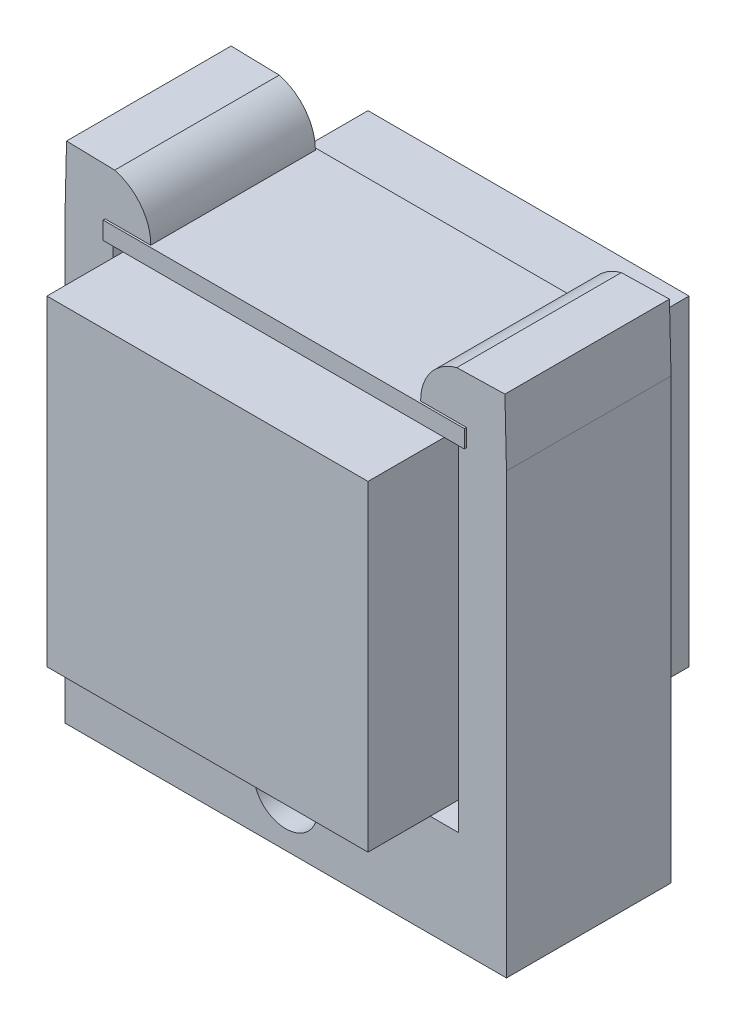
ISO-10303-21;
HEADER;
FILE_DESCRIPTION(('STEP AP214'),'2;1');
FILE_NAME('part.step','',(''),(''),'','','');
FILE_SCHEMA(('AUTOMOTIVE_DESIGN { 1 0 10303 214 1 1 1 1 }'));
ENDSEC;
DATA;
#1=APPLICATION_CONTEXT('core data for automotive mechanical design processes');
#2=APPLICATION_PROTOCOL_DEFINITION('international standard','automotive_design',2000,#1);
#3=PRODUCT_CONTEXT('',#1,'mechanical');
#4=PRODUCT('Part','Part','',(#3));
#5=PRODUCT_RELATED_PRODUCT_CATEGORY('part','',(#4));
#6=PRODUCT_DEFINITION_FORMATION('','',#4);
#7=PRODUCT_DEFINITION_CONTEXT('part definition',#1,'design');
#8=PRODUCT_DEFINITION('design','',#6,#7);
#9=PRODUCT_DEFINITION_SHAPE('','',#8);
#10=(LENGTH_UNIT() NAMED_UNIT(*) SI_UNIT(.MILLI.,.METRE.));
#11=(NAMED_UNIT(*) PLANE_ANGLE_UNIT() SI_UNIT($,.RADIAN.));
#12=(NAMED_UNIT(*) SI_UNIT($,.STERADIAN.) SOLID_ANGLE_UNIT());
#13=UNCERTAINTY_MEASURE_WITH_UNIT(LENGTH_MEASURE(1.E-05),#10,'distance_accuracy_value','');
#14=(GEOMETRIC_REPRESENTATION_CONTEXT(3) GLOBAL_UNCERTAINTY_ASSIGNED_CONTEXT((#13)) GLOBAL_UNIT_ASSIGNED_CONTEXT((#10,
#11,#12)) REPRESENTATION_CONTEXT('',''));
#15=CARTESIAN_POINT('',(0.,0.,0.));
#16=DIRECTION('',(0.,0.,1.));
#17=DIRECTION('',(1.,0.,0.));
#18=AXIS2_PLACEMENT_3D('',#15,#16,#17);
#19=CARTESIAN_POINT('',(-22.8214269050394,2.23208603977332,10.25));
#20=DIRECTION('',(0.,0.,-1.));
#21=DIRECTION('',(-1.,0.,0.));
#22=AXIS2_PLACEMENT_3D('',#19,#20,#21);
#23=CYLINDRICAL_SURFACE('',#22,6.01661439149229);
#24=CARTESIAN_POINT('',(-22.8214269050394,2.23208603977332,-10.25));
#25=DIRECTION('',(0.,0.,1.));
#26=DIRECTION('',(1.,0.,0.));
#27=AXIS2_PLACEMENT_3D('',#24,#25,#26);
#28=CIRCLE('',#27,6.01661439149229);
#29=CARTESIAN_POINT('',(-21.3065171783756,8.05486005702417,-10.25));
#30=VERTEX_POINT('',#29);
#31=CARTESIAN_POINT('',(-16.8065171783756,2.08887390342417,-10.25));
#32=VERTEX_POINT('',#31);
#33=EDGE_CURVE('E199',#30,#32,#28,.F.);
#34=ORIENTED_EDGE('',*,*,#33,.F.);
#35=DIRECTION('',(0.,0.,-1.));
#36=VECTOR('',#35,1.);
#37=CARTESIAN_POINT('',(-21.3065171783756,8.05486005702417,10.25));
#38=LINE('',#37,#36);
#39=CARTESIAN_POINT('',(-21.3065171783756,8.05486005702417,10.25));
#40=VERTEX_POINT('',#39);
#41=EDGE_CURVE('E12',#40,#30,#38,.T.);
#42=ORIENTED_EDGE('',*,*,#41,.F.);
#43=CARTESIAN_POINT('',(-22.8214269050394,2.23208603977332,10.25));
#44=DIRECTION('',(0.,0.,1.));
#45=DIRECTION('',(1.,0.,0.));
#46=AXIS2_PLACEMENT_3D('',#43,#44,#45);
#47=CIRCLE('',#46,6.01661439149229);
#48=CARTESIAN_POINT('',(-16.8065171783756,2.08887390342417,10.25));
#49=VERTEX_POINT('',#48);
#50=EDGE_CURVE('E242',#40,#49,#47,.F.);
#51=ORIENTED_EDGE('',*,*,#50,.T.);
#52=DIRECTION('',(0.,0.,-1.));
#53=VECTOR('',#52,1.);
#54=CARTESIAN_POINT('',(-16.8065171783756,2.08887390342417,10.25));
#55=LINE('',#54,#53);
#56=EDGE_CURVE('E70',#49,#32,#55,.T.);
#57=ORIENTED_EDGE('',*,*,#56,.T.);
#58=EDGE_LOOP('',(#34,#42,#51,#57));
#59=FACE_BOUND('',#58,.T.);
#60=ADVANCED_FACE('F54',(#59),#23,.T.);
#61=CARTESIAN_POINT('',(0.179602042615673,7.54328578985767,10.25));
#62=DIRECTION('',(0.0238027779462909,0.999716673744136,0.));
#63=DIRECTION('',(-0.999716673744136,0.0238027779462909,0.));
#64=AXIS2_PLACEMENT_3D('',#61,#62,#63);
#65=PLANE('',#64);
#66=DIRECTION('',(0.999716673744136,-0.0238027779462909,0.));
#67=VECTOR('',#66,1.);
#68=CARTESIAN_POINT('',(0.179602042615673,7.54328578985767,-10.25));
#69=LINE('',#68,#67);
#70=CARTESIAN_POINT('',(-27.3048172208404,8.19767672470191,-10.25));
#71=VERTEX_POINT('',#70);
#72=EDGE_CURVE('E201',#71,#30,#69,.T.);
#73=ORIENTED_EDGE('',*,*,#72,.F.);
#74=DIRECTION('',(0.,0.,-1.));
#75=VECTOR('',#74,1.);
#76=CARTESIAN_POINT('',(-27.3048172208404,8.19767672470191,10.25));
#77=LINE('',#76,#75);
#78=CARTESIAN_POINT('',(-27.3048172208404,8.19767672470191,10.25));
#79=VERTEX_POINT('',#78);
#80=EDGE_CURVE('E62',#79,#71,#77,.T.);
#81=ORIENTED_EDGE('',*,*,#80,.F.);
#82=DIRECTION('',(0.999716673744136,-0.0238027779462909,0.));
#83=VECTOR('',#82,1.);
#84=CARTESIAN_POINT('',(0.179602042615673,7.54328578985767,10.25));
#85=LINE('',#84,#83);
#86=EDGE_CURVE('E293',#79,#40,#85,.T.);
#87=ORIENTED_EDGE('',*,*,#86,.T.);
#88=ORIENTED_EDGE('',*,*,#41,.T.);
#89=EDGE_LOOP('',(#73,#81,#87,#88));
#90=FACE_BOUND('',#89,.T.);
#91=ADVANCED_FACE('F279',(#90),#65,.T.);
#92=CARTESIAN_POINT('',(-27.4844192634561,0.654390934844237,10.25));
#93=DIRECTION('',(-0.999716673744136,0.0238027779462906,0.));
#94=DIRECTION('',(-0.0238027779462906,-0.999716673744136,0.));
#95=AXIS2_PLACEMENT_3D('',#92,#93,#94);
#96=PLANE('',#95);
#97=DIRECTION('',(0.0238027779462906,0.999716673744136,0.));
#98=VECTOR('',#97,1.);
#99=CARTESIAN_POINT('',(-27.4844192634561,0.654390934844237,-10.25));
#100=LINE('',#99,#98);
#101=CARTESIAN_POINT('',(-27.5,0.,-10.25));
#102=VERTEX_POINT('',#101);
#103=EDGE_CURVE('E204',#102,#71,#100,.T.);
#104=ORIENTED_EDGE('',*,*,#103,.F.);
#105=DIRECTION('',(0.,0.,-1.));
#106=VECTOR('',#105,1.);
#107=CARTESIAN_POINT('',(-27.5,0.,10.25));
#108=LINE('',#107,#106);
#109=CARTESIAN_POINT('',(-27.5,0.,10.25));
#110=VERTEX_POINT('',#109);
#111=EDGE_CURVE('E268',#110,#102,#108,.T.);
#112=ORIENTED_EDGE('',*,*,#111,.F.);
#113=DIRECTION('',(0.0238027779462906,0.999716673744136,0.));
#114=VECTOR('',#113,1.);
#115=CARTESIAN_POINT('',(-27.4844192634561,0.654390934844237,10.25));
#116=LINE('',#115,#114);
#117=EDGE_CURVE('E275',#110,#79,#116,.T.);
#118=ORIENTED_EDGE('',*,*,#117,.T.);
#119=ORIENTED_EDGE('',*,*,#80,.T.);
#120=EDGE_LOOP('',(#104,#112,#118,#119));
#121=FACE_BOUND('',#120,.T.);
#122=ADVANCED_FACE('F273',(#121),#96,.T.);
#123=CARTESIAN_POINT('',(-27.5,0.,10.25));
#124=DIRECTION('',(-1.,0.,0.));
#125=DIRECTION('',(0.,0.,1.));
#126=AXIS2_PLACEMENT_3D('',#123,#124,#125);
#127=PLANE('',#126);
#128=DIRECTION('',(0.,1.,0.));
#129=VECTOR('',#128,1.);
#130=CARTESIAN_POINT('',(-27.5,0.,-10.25));
#131=LINE('',#130,#129);
#132=CARTESIAN_POINT('',(-27.5,-54.7,-10.25));
#133=VERTEX_POINT('',#132);
#134=EDGE_CURVE('E207',#133,#102,#131,.T.);
#135=ORIENTED_EDGE('',*,*,#134,.F.);
#136=DIRECTION('',(0.,0.,-1.));
#137=VECTOR('',#136,1.);
#138=CARTESIAN_POINT('',(-27.5,-54.7,10.25));
#139=LINE('',#138,#137);
#140=CARTESIAN_POINT('',(-27.5,-54.7,10.25));
#141=VERTEX_POINT('',#140);
#142=EDGE_CURVE('E266',#141,#133,#139,.T.);
#143=ORIENTED_EDGE('',*,*,#142,.F.);
#144=DIRECTION('',(0.,1.,0.));
#145=VECTOR('',#144,1.);
#146=CARTESIAN_POINT('',(-27.5,0.,10.25));
#147=LINE('',#146,#145);
#148=EDGE_CURVE('E290',#141,#110,#147,.T.);
#149=ORIENTED_EDGE('',*,*,#148,.T.);
#150=ORIENTED_EDGE('',*,*,#111,.T.);
#151=EDGE_LOOP('',(#135,#143,#149,#150));
#152=FACE_BOUND('',#151,.T.);
#153=ADVANCED_FACE('F287',(#152),#127,.T.);
#154=CARTESIAN_POINT('',(0.,-54.7,10.25));
#155=DIRECTION('',(0.,-1.,0.));
#156=DIRECTION('',(0.,0.,-1.));
#157=AXIS2_PLACEMENT_3D('',#154,#155,#156);
#158=PLANE('',#157);
#159=DIRECTION('',(-1.,0.,0.));
#160=VECTOR('',#159,1.);
#161=CARTESIAN_POINT('',(0.,-54.7,-10.25));
#162=LINE('',#161,#160);
#163=CARTESIAN_POINT('',(27.5,-54.7,-10.25));
#164=VERTEX_POINT('',#163);
#165=EDGE_CURVE('E210',#164,#133,#162,.T.);
#166=ORIENTED_EDGE('',*,*,#165,.F.);
#167=DIRECTION('',(0.,0.,-1.));
#168=VECTOR('',#167,1.);
#169=CARTESIAN_POINT('',(27.5,-54.7,10.25));
#170=LINE('',#169,#168);
#171=CARTESIAN_POINT('',(27.5,-54.7,10.25));
#172=VERTEX_POINT('',#171);
#173=EDGE_CURVE('E264',#172,#164,#170,.T.);
#174=ORIENTED_EDGE('',*,*,#173,.F.);
#175=DIRECTION('',(-1.,0.,0.));
#176=VECTOR('',#175,1.);
#177=CARTESIAN_POINT('',(0.,-54.7,10.25));
#178=LINE('',#177,#176);
#179=EDGE_CURVE('E295',#172,#141,#178,.T.);
#180=ORIENTED_EDGE('',*,*,#179,.T.);
#181=ORIENTED_EDGE('',*,*,#142,.T.);
#182=EDGE_LOOP('',(#166,#174,#180,#181));
#183=FACE_BOUND('',#182,.T.);
#184=ADVANCED_FACE('F342',(#183),#158,.T.);
#185=CARTESIAN_POINT('',(27.5,0.,10.25));
#186=DIRECTION('',(-1.,0.,0.));
#187=DIRECTION('',(0.,0.,1.));
#188=AXIS2_PLACEMENT_3D('',#185,#186,#187);
#189=PLANE('',#188);
#190=DIRECTION('',(0.,1.,0.));
#191=VECTOR('',#190,1.);
#192=CARTESIAN_POINT('',(27.5,0.,-10.25));
#193=LINE('',#192,#191);
#194=CARTESIAN_POINT('',(27.5,0.,-10.25));
#195=VERTEX_POINT('',#194);
#196=EDGE_CURVE('E213',#164,#195,#193,.T.);
#197=ORIENTED_EDGE('',*,*,#196,.T.);
#198=DIRECTION('',(0.,0.,-1.));
#199=VECTOR('',#198,1.);
#200=CARTESIAN_POINT('',(27.5,0.,10.25));
#201=LINE('',#200,#199);
#202=CARTESIAN_POINT('',(27.5,0.,10.25));
#203=VERTEX_POINT('',#202);
#204=EDGE_CURVE('E261',#203,#195,#201,.T.);
#205=ORIENTED_EDGE('',*,*,#204,.F.);
#206=DIRECTION('',(0.,1.,0.));
#207=VECTOR('',#206,1.);
#208=CARTESIAN_POINT('',(27.5,0.,10.25));
#209=LINE('',#208,#207);
#210=EDGE_CURVE('E301',#172,#203,#209,.T.);
#211=ORIENTED_EDGE('',*,*,#210,.F.);
#212=ORIENTED_EDGE('',*,*,#173,.T.);
#213=EDGE_LOOP('',(#197,#205,#211,#212));
#214=FACE_BOUND('',#213,.T.);
#215=ADVANCED_FACE('F345',(#214),#189,.F.);
#216=CARTESIAN_POINT('',(27.4844192634561,0.654390934844237,10.25));
#217=DIRECTION('',(-0.999716673744136,-0.0238027779462906,0.));
#218=DIRECTION('',(0.0238027779462906,-0.999716673744136,0.));
#219=AXIS2_PLACEMENT_3D('',#216,#217,#218);
#220=PLANE('',#219);
#221=DIRECTION('',(-0.0238027779462906,0.999716673744136,0.));
#222=VECTOR('',#221,1.);
#223=CARTESIAN_POINT('',(27.4844192634561,0.654390934844237,-10.25));
#224=LINE('',#223,#222);
#225=CARTESIAN_POINT('',(27.3048172208404,8.19767672470191,-10.25));
#226=VERTEX_POINT('',#225);
#227=EDGE_CURVE('E215',#195,#226,#224,.T.);
#228=ORIENTED_EDGE('',*,*,#227,.T.);
#229=DIRECTION('',(0.,0.,-1.));
#230=VECTOR('',#229,1.);
#231=CARTESIAN_POINT('',(27.3048172208404,8.19767672470191,10.25));
#232=LINE('',#231,#230);
#233=CARTESIAN_POINT('',(27.3048172208404,8.19767672470191,10.25));
#234=VERTEX_POINT('',#233);
#235=EDGE_CURVE('E258',#234,#226,#232,.T.);
#236=ORIENTED_EDGE('',*,*,#235,.F.);
#237=DIRECTION('',(-0.0238027779462906,0.999716673744136,0.));
#238=VECTOR('',#237,1.);
#239=CARTESIAN_POINT('',(27.4844192634561,0.654390934844237,10.25));
#240=LINE('',#239,#238);
#241=EDGE_CURVE('E303',#203,#234,#240,.T.);
#242=ORIENTED_EDGE('',*,*,#241,.F.);
#243=ORIENTED_EDGE('',*,*,#204,.T.);
#244=EDGE_LOOP('',(#228,#236,#242,#243));
#245=FACE_BOUND('',#244,.T.);
#246=ADVANCED_FACE('F349',(#245),#220,.F.);
#247=CARTESIAN_POINT('',(-0.179602042615673,7.54328578985767,10.25));
#248=DIRECTION('',(0.0238027779462909,-0.999716673744136,0.));
#249=DIRECTION('',(0.999716673744136,0.0238027779462909,0.));
#250=AXIS2_PLACEMENT_3D('',#247,#248,#249);
#251=PLANE('',#250);
#252=DIRECTION('',(-0.999716673744136,-0.0238027779462909,0.));
#253=VECTOR('',#252,1.);
#254=CARTESIAN_POINT('',(-0.179602042615673,7.54328578985767,-10.25));
#255=LINE('',#254,#253);
#256=CARTESIAN_POINT('',(21.3065171783756,8.05486005702417,-10.25));
#257=VERTEX_POINT('',#256);
#258=EDGE_CURVE('E217',#226,#257,#255,.T.);
#259=ORIENTED_EDGE('',*,*,#258,.T.);
#260=DIRECTION('',(0.,0.,-1.));
#261=VECTOR('',#260,1.);
#262=CARTESIAN_POINT('',(21.3065171783756,8.05486005702417,10.25));
#263=LINE('',#262,#261);
#264=CARTESIAN_POINT('',(21.3065171783756,8.05486005702417,10.25));
#265=VERTEX_POINT('',#264);
#266=EDGE_CURVE('E255',#265,#257,#263,.T.);
#267=ORIENTED_EDGE('',*,*,#266,.F.);
#268=DIRECTION('',(-0.999716673744136,-0.0238027779462909,0.));
#269=VECTOR('',#268,1.);
#270=CARTESIAN_POINT('',(-0.179602042615673,7.54328578985767,10.25));
#271=LINE('',#270,#269);
#272=EDGE_CURVE('E305',#234,#265,#271,.T.);
#273=ORIENTED_EDGE('',*,*,#272,.F.);
#274=ORIENTED_EDGE('',*,*,#235,.T.);
#275=EDGE_LOOP('',(#259,#267,#273,#274));
#276=FACE_BOUND('',#275,.T.);
#277=ADVANCED_FACE('F353',(#276),#251,.F.);
#278=CARTESIAN_POINT('',(22.8214269050394,2.23208603977332,10.25));
#279=DIRECTION('',(0.,0.,-1.));
#280=DIRECTION('',(-1.,0.,0.));
#281=AXIS2_PLACEMENT_3D('',#278,#279,#280);
#282=CYLINDRICAL_SURFACE('',#281,6.01661439149229);
#283=CARTESIAN_POINT('',(22.8214269050394,2.23208603977332,-10.25));
#284=DIRECTION('',(0.,0.,1.));
#285=DIRECTION('',(1.,0.,0.));
#286=AXIS2_PLACEMENT_3D('',#283,#284,#285);
#287=CIRCLE('',#286,6.01661439149229);
#288=CARTESIAN_POINT('',(16.8065171783756,2.08887390342417,-10.25));
#289=VERTEX_POINT('',#288);
#290=EDGE_CURVE('E219',#257,#289,#287,.T.);
#291=ORIENTED_EDGE('',*,*,#290,.T.);
#292=DIRECTION('',(0.,0.,-1.));
#293=VECTOR('',#292,1.);
#294=CARTESIAN_POINT('',(16.8065171783756,2.08887390342417,10.25));
#295=LINE('',#294,#293);
#296=CARTESIAN_POINT('',(16.8065171783756,2.08887390342417,10.25));
#297=VERTEX_POINT('',#296);
#298=EDGE_CURVE('E252',#297,#289,#295,.T.);
#299=ORIENTED_EDGE('',*,*,#298,.F.);
#300=CARTESIAN_POINT('',(22.8214269050394,2.23208603977332,10.25));
#301=DIRECTION('',(0.,0.,1.));
#302=DIRECTION('',(1.,0.,0.));
#303=AXIS2_PLACEMENT_3D('',#300,#301,#302);
#304=CIRCLE('',#303,6.01661439149229);
#305=EDGE_CURVE('E307',#265,#297,#304,.T.);
#306=ORIENTED_EDGE('',*,*,#305,.F.);
#307=ORIENTED_EDGE('',*,*,#266,.T.);
#308=EDGE_LOOP('',(#291,#299,#306,#307));
#309=FACE_BOUND('',#308,.T.);
#310=ADVANCED_FACE('F357',(#309),#282,.T.);
#311=CARTESIAN_POINT('',(-0.0401848083656906,1.68776195135887,10.25));
#312=DIRECTION('',(-0.0238027779462909,0.999716673744136,0.));
#313=DIRECTION('',(-0.999716673744136,-0.0238027779462909,0.));
#314=AXIS2_PLACEMENT_3D('',#311,#312,#313);
#315=PLANE('',#314);
#316=DIRECTION('',(0.999716673744136,0.0238027779462909,0.));
#317=VECTOR('',#316,1.);
#318=CARTESIAN_POINT('',(-0.0401848083656906,1.68776195135887,-10.25));
#319=LINE('',#318,#317);
#320=CARTESIAN_POINT('',(21.4476338885182,2.1993766822371,-10.25));
#321=VERTEX_POINT('',#320);
#322=EDGE_CURVE('E221',#289,#321,#319,.T.);
#323=ORIENTED_EDGE('',*,*,#322,.T.);
#324=DIRECTION('',(0.,0.,-1.));
#325=VECTOR('',#324,1.);
#326=CARTESIAN_POINT('',(21.4476338885182,2.1993766822371,10.25));
#327=LINE('',#326,#325);
#328=CARTESIAN_POINT('',(21.4476338885182,2.1993766822371,10.25));
#329=VERTEX_POINT('',#328);
#330=EDGE_CURVE('E250',#329,#321,#327,.T.);
#331=ORIENTED_EDGE('',*,*,#330,.F.);
#332=DIRECTION('',(0.999716673744136,0.0238027779462909,0.));
#333=VECTOR('',#332,1.);
#334=CARTESIAN_POINT('',(-0.0401848083656906,1.68776195135887,10.25));
#335=LINE('',#334,#333);
#336=EDGE_CURVE('E309',#297,#329,#335,.T.);
#337=ORIENTED_EDGE('',*,*,#336,.F.);
#338=ORIENTED_EDGE('',*,*,#298,.T.);
#339=EDGE_LOOP('',(#323,#331,#337,#338));
#340=FACE_BOUND('',#339,.T.);
#341=ADVANCED_FACE('F361',(#340),#315,.F.);
#342=CARTESIAN_POINT('',(21.4878186968839,0.511614730878188,10.25));
#343=DIRECTION('',(-0.999716673744136,-0.023802777946289,0.));
#344=DIRECTION('',(0.023802777946289,-0.999716673744136,0.));
#345=AXIS2_PLACEMENT_3D('',#342,#343,#344);
#346=PLANE('',#345);
#347=DIRECTION('',(-0.023802777946289,0.999716673744136,0.));
#348=VECTOR('',#347,1.);
#349=CARTESIAN_POINT('',(21.4878186968839,0.511614730878188,-10.25));
#350=LINE('',#349,#348);
#351=CARTESIAN_POINT('',(21.5,0.,-10.25));
#352=VERTEX_POINT('',#351);
#353=EDGE_CURVE('E224',#352,#321,#350,.T.);
#354=ORIENTED_EDGE('',*,*,#353,.F.);
#355=DIRECTION('',(0.,0.,-1.));
#356=VECTOR('',#355,1.);
#357=CARTESIAN_POINT('',(21.5,0.,10.25));
#358=LINE('',#357,#356);
#359=CARTESIAN_POINT('',(21.5,0.,10.25));
#360=VERTEX_POINT('',#359);
#361=EDGE_CURVE('E248',#360,#352,#358,.T.);
#362=ORIENTED_EDGE('',*,*,#361,.F.);
#363=DIRECTION('',(-0.023802777946289,0.999716673744136,0.));
#364=VECTOR('',#363,1.);
#365=CARTESIAN_POINT('',(21.4878186968839,0.511614730878188,10.25));
#366=LINE('',#365,#364);
#367=EDGE_CURVE('E311',#360,#329,#366,.T.);
#368=ORIENTED_EDGE('',*,*,#367,.T.);
#369=ORIENTED_EDGE('',*,*,#330,.T.);
#370=EDGE_LOOP('',(#354,#362,#368,#369));
#371=FACE_BOUND('',#370,.T.);
#372=ADVANCED_FACE('F365',(#371),#346,.T.);
#373=CARTESIAN_POINT('',(21.5,0.,10.25));
#374=DIRECTION('',(-1.,0.,0.));
#375=DIRECTION('',(0.,0.,1.));
#376=AXIS2_PLACEMENT_3D('',#373,#374,#375);
#377=PLANE('',#376);
#378=DIRECTION('',(0.,1.,0.));
#379=VECTOR('',#378,1.);
#380=CARTESIAN_POINT('',(21.5,0.,-10.25));
#381=LINE('',#380,#379);
#382=CARTESIAN_POINT('',(21.5,-42.,-10.25));
#383=VERTEX_POINT('',#382);
#384=EDGE_CURVE('E227',#383,#352,#381,.T.);
#385=ORIENTED_EDGE('',*,*,#384,.F.);
#386=DIRECTION('',(0.,0.,-1.));
#387=VECTOR('',#386,1.);
#388=CARTESIAN_POINT('',(21.5,-42.,10.25));
#389=LINE('',#388,#387);
#390=CARTESIAN_POINT('',(21.5,-42.,10.25));
#391=VERTEX_POINT('',#390);
#392=EDGE_CURVE('E246',#391,#383,#389,.T.);
#393=ORIENTED_EDGE('',*,*,#392,.F.);
#394=DIRECTION('',(0.,1.,0.));
#395=VECTOR('',#394,1.);
#396=CARTESIAN_POINT('',(21.5,0.,10.25));
#397=LINE('',#396,#395);
#398=EDGE_CURVE('E314',#391,#360,#397,.T.);
#399=ORIENTED_EDGE('',*,*,#398,.T.);
#400=ORIENTED_EDGE('',*,*,#361,.T.);
#401=EDGE_LOOP('',(#385,#393,#399,#400));
#402=FACE_BOUND('',#401,.T.);
#403=ADVANCED_FACE('F369',(#402),#377,.T.);
#404=CARTESIAN_POINT('',(0.,-42.,10.25));
#405=DIRECTION('',(0.,1.,0.));
#406=DIRECTION('',(0.,0.,1.));
#407=AXIS2_PLACEMENT_3D('',#404,#405,#406);
#408=PLANE('',#407);
#409=DIRECTION('',(1.,0.,0.));
#410=VECTOR('',#409,1.);
#411=CARTESIAN_POINT('',(0.,-42.,-10.25));
#412=LINE('',#411,#410);
#413=CARTESIAN_POINT('',(-21.5,-42.,-10.25));
#414=VERTEX_POINT('',#413);
#415=EDGE_CURVE('E230',#414,#383,#412,.T.);
#416=ORIENTED_EDGE('',*,*,#415,.F.);
#417=DIRECTION('',(0.,0.,-1.));
#418=VECTOR('',#417,1.);
#419=CARTESIAN_POINT('',(-21.5,-42.,10.25));
#420=LINE('',#419,#418);
#421=CARTESIAN_POINT('',(-21.5,-42.,10.25));
#422=VERTEX_POINT('',#421);
#423=EDGE_CURVE('E188',#422,#414,#420,.T.);
#424=ORIENTED_EDGE('',*,*,#423,.F.);
#425=DIRECTION('',(1.,0.,0.));
#426=VECTOR('',#425,1.);
#427=CARTESIAN_POINT('',(0.,-42.,10.25));
#428=LINE('',#427,#426);
#429=EDGE_CURVE('E178',#422,#391,#428,.T.);
#430=ORIENTED_EDGE('',*,*,#429,.T.);
#431=ORIENTED_EDGE('',*,*,#392,.T.);
#432=EDGE_LOOP('',(#416,#424,#430,#431));
#433=FACE_BOUND('',#432,.T.);
#434=ADVANCED_FACE('F318',(#433),#408,.T.);
#435=CARTESIAN_POINT('',(-21.5,0.,10.25));
#436=DIRECTION('',(-1.,0.,0.));
#437=DIRECTION('',(0.,0.,1.));
#438=AXIS2_PLACEMENT_3D('',#435,#436,#437);
#439=PLANE('',#438);
#440=DIRECTION('',(0.,1.,0.));
#441=VECTOR('',#440,1.);
#442=CARTESIAN_POINT('',(-21.5,0.,-10.25));
#443=LINE('',#442,#441);
#444=CARTESIAN_POINT('',(-21.5,0.,-10.25));
#445=VERTEX_POINT('',#444);
#446=EDGE_CURVE('E185',#414,#445,#443,.T.);
#447=ORIENTED_EDGE('',*,*,#446,.T.);
#448=DIRECTION('',(0.,0.,-1.));
#449=VECTOR('',#448,1.);
#450=CARTESIAN_POINT('',(-21.5,0.,10.25));
#451=LINE('',#450,#449);
#452=CARTESIAN_POINT('',(-21.5,0.,10.25));
#453=VERTEX_POINT('',#452);
#454=EDGE_CURVE('E182',#453,#445,#451,.T.);
#455=ORIENTED_EDGE('',*,*,#454,.F.);
#456=DIRECTION('',(0.,1.,0.));
#457=VECTOR('',#456,1.);
#458=CARTESIAN_POINT('',(-21.5,0.,10.25));
#459=LINE('',#458,#457);
#460=EDGE_CURVE('E169',#422,#453,#459,.T.);
#461=ORIENTED_EDGE('',*,*,#460,.F.);
#462=ORIENTED_EDGE('',*,*,#423,.T.);
#463=EDGE_LOOP('',(#447,#455,#461,#462));
#464=FACE_BOUND('',#463,.T.);
#465=ADVANCED_FACE('F183',(#464),#439,.F.);
#466=CARTESIAN_POINT('',(-21.4878186968839,0.511614730878188,10.25));
#467=DIRECTION('',(-0.999716673744136,0.023802777946289,0.));
#468=DIRECTION('',(-0.023802777946289,-0.999716673744136,0.));
#469=AXIS2_PLACEMENT_3D('',#466,#467,#468);
#470=PLANE('',#469);
#471=DIRECTION('',(0.023802777946289,0.999716673744136,0.));
#472=VECTOR('',#471,1.);
#473=CARTESIAN_POINT('',(-21.4878186968839,0.511614730878188,-10.25));
#474=LINE('',#473,#472);
#475=CARTESIAN_POINT('',(-21.4476338885182,2.1993766822371,-10.25));
#476=VERTEX_POINT('',#475);
#477=EDGE_CURVE('E234',#445,#476,#474,.T.);
#478=ORIENTED_EDGE('',*,*,#477,.T.);
#479=DIRECTION('',(0.,0.,-1.));
#480=VECTOR('',#479,1.);
#481=CARTESIAN_POINT('',(-21.4476338885182,2.1993766822371,10.25));
#482=LINE('',#481,#480);
#483=CARTESIAN_POINT('',(-21.4476338885182,2.1993766822371,10.25));
#484=VERTEX_POINT('',#483);
#485=EDGE_CURVE('E120',#484,#476,#482,.T.);
#486=ORIENTED_EDGE('',*,*,#485,.F.);
#487=DIRECTION('',(0.023802777946289,0.999716673744136,0.));
#488=VECTOR('',#487,1.);
#489=CARTESIAN_POINT('',(-21.4878186968839,0.511614730878188,10.25));
#490=LINE('',#489,#488);
#491=EDGE_CURVE('E175',#453,#484,#490,.T.);
#492=ORIENTED_EDGE('',*,*,#491,.F.);
#493=ORIENTED_EDGE('',*,*,#454,.T.);
#494=EDGE_LOOP('',(#478,#486,#492,#493));
#495=FACE_BOUND('',#494,.T.);
#496=ADVANCED_FACE('F190',(#495),#470,.F.);
#497=CARTESIAN_POINT('',(0.0401848083656906,1.68776195135887,10.25));
#498=DIRECTION('',(-0.0238027779462909,-0.999716673744136,0.));
#499=DIRECTION('',(0.999716673744136,-0.0238027779462909,0.));
#500=AXIS2_PLACEMENT_3D('',#497,#498,#499);
#501=PLANE('',#500);
#502=DIRECTION('',(-0.999716673744136,0.0238027779462909,0.));
#503=VECTOR('',#502,1.);
#504=CARTESIAN_POINT('',(0.0401848083656906,1.68776195135887,-10.25));
#505=LINE('',#504,#503);
#506=EDGE_CURVE('E236',#32,#476,#505,.T.);
#507=ORIENTED_EDGE('',*,*,#506,.F.);
#508=ORIENTED_EDGE('',*,*,#56,.F.);
#509=DIRECTION('',(-0.999716673744136,0.0238027779462909,0.));
#510=VECTOR('',#509,1.);
#511=CARTESIAN_POINT('',(0.0401848083656906,1.68776195135887,10.25));
#512=LINE('',#511,#510);
#513=EDGE_CURVE('E191',#49,#484,#512,.T.);
#514=ORIENTED_EDGE('',*,*,#513,.T.);
#515=ORIENTED_EDGE('',*,*,#485,.T.);
#516=EDGE_LOOP('',(#507,#508,#514,#515));
#517=FACE_BOUND('',#516,.T.);
#518=ADVANCED_FACE('F320',(#517),#501,.T.);
#519=CARTESIAN_POINT('',(0.,-48.35,10.25));
#520=DIRECTION('',(0.,0.,-1.));
#521=DIRECTION('',(-1.,0.,0.));
#522=AXIS2_PLACEMENT_3D('',#519,#520,#521);
#523=CYLINDRICAL_SURFACE('',#522,4.);
#524=CARTESIAN_POINT('',(0.,-48.35,10.25));
#525=DIRECTION('',(0.,0.,1.));
#526=DIRECTION('',(1.,0.,0.));
#527=AXIS2_PLACEMENT_3D('',#524,#525,#526);
#528=CIRCLE('',#527,4.);
#529=CARTESIAN_POINT('',(4.,-48.35,10.25));
#530=VERTEX_POINT('',#529);
#531=EDGE_CURVE('E193',#530,#530,#528,.T.);
#532=ORIENTED_EDGE('',*,*,#531,.T.);
#533=EDGE_LOOP('',(#532));
#534=FACE_BOUND('',#533,.T.);
#535=CARTESIAN_POINT('',(0.,-48.35,-10.25));
#536=DIRECTION('',(0.,0.,1.));
#537=DIRECTION('',(1.,0.,0.));
#538=AXIS2_PLACEMENT_3D('',#535,#536,#537);
#539=CIRCLE('',#538,4.);
#540=CARTESIAN_POINT('',(4.,-48.35,-10.25));
#541=VERTEX_POINT('',#540);
#542=EDGE_CURVE('E239',#541,#541,#539,.T.);
#543=ORIENTED_EDGE('',*,*,#542,.F.);
#544=EDGE_LOOP('',(#543));
#545=FACE_BOUND('',#544,.T.);
#546=ADVANCED_FACE('F322',(#534,#545),#523,.F.);
#547=CARTESIAN_POINT('',(0.,0.,10.25));
#548=DIRECTION('',(0.,0.,1.));
#549=DIRECTION('',(1.,0.,0.));
#550=AXIS2_PLACEMENT_3D('',#547,#548,#549);
#551=PLANE('',#550);
#552=ORIENTED_EDGE('',*,*,#50,.F.);
#553=ORIENTED_EDGE('',*,*,#86,.F.);
#554=ORIENTED_EDGE('',*,*,#117,.F.);
#555=ORIENTED_EDGE('',*,*,#148,.F.);
#556=ORIENTED_EDGE('',*,*,#179,.F.);
#557=ORIENTED_EDGE('',*,*,#210,.T.);
#558=ORIENTED_EDGE('',*,*,#241,.T.);
#559=ORIENTED_EDGE('',*,*,#272,.T.);
#560=ORIENTED_EDGE('',*,*,#305,.T.);
#561=ORIENTED_EDGE('',*,*,#336,.T.);
#562=ORIENTED_EDGE('',*,*,#367,.F.);
#563=ORIENTED_EDGE('',*,*,#398,.F.);
#564=ORIENTED_EDGE('',*,*,#429,.F.);
#565=ORIENTED_EDGE('',*,*,#460,.T.);
#566=ORIENTED_EDGE('',*,*,#491,.T.);
#567=ORIENTED_EDGE('',*,*,#513,.F.);
#568=EDGE_LOOP('',(#552,#553,#554,#555,#556,#557,#558,#559,#560,#561,#562,#563,#564,#565,#566,#567));
#569=FACE_BOUND('',#568,.T.);
#570=ORIENTED_EDGE('',*,*,#531,.F.);
#571=EDGE_LOOP('',(#570));
#572=FACE_BOUND('',#571,.T.);
#573=ADVANCED_FACE('F171',(#569,#572),#551,.T.);
#574=CARTESIAN_POINT('',(0.,0.,-10.25));
#575=DIRECTION('',(0.,0.,1.));
#576=DIRECTION('',(1.,0.,0.));
#577=AXIS2_PLACEMENT_3D('',#574,#575,#576);
#578=PLANE('',#577);
#579=ORIENTED_EDGE('',*,*,#33,.T.);
#580=ORIENTED_EDGE('',*,*,#506,.T.);
#581=ORIENTED_EDGE('',*,*,#477,.F.);
#582=ORIENTED_EDGE('',*,*,#446,.F.);
#583=ORIENTED_EDGE('',*,*,#415,.T.);
#584=ORIENTED_EDGE('',*,*,#384,.T.);
#585=ORIENTED_EDGE('',*,*,#353,.T.);
#586=ORIENTED_EDGE('',*,*,#322,.F.);
#587=ORIENTED_EDGE('',*,*,#290,.F.);
#588=ORIENTED_EDGE('',*,*,#258,.F.);
#589=ORIENTED_EDGE('',*,*,#227,.F.);
#590=ORIENTED_EDGE('',*,*,#196,.F.);
#591=ORIENTED_EDGE('',*,*,#165,.T.);
#592=ORIENTED_EDGE('',*,*,#134,.T.);
#593=ORIENTED_EDGE('',*,*,#103,.T.);
#594=ORIENTED_EDGE('',*,*,#72,.T.);
#595=EDGE_LOOP('',(#579,#580,#581,#582,#583,#584,#585,#586,#587,#588,#589,#590,#591,#592,#593,#594));
#596=FACE_BOUND('',#595,.T.);
#597=ORIENTED_EDGE('',*,*,#542,.T.);
#598=EDGE_LOOP('',(#597));
#599=FACE_BOUND('',#598,.T.);
#600=ADVANCED_FACE('F281',(#596,#599),#578,.F.);
#601=CLOSED_SHELL('',(#60,#91,#122,#153,#184,#215,#246,#277,#310,#341,#372,#403,#434,#465,#496,
#518,#546,#573,#600));
#602=MANIFOLD_SOLID_BREP('B2',#601);
#603=CARTESIAN_POINT('',(20.,-40.,20.));
#604=DIRECTION('',(1.,0.,0.));
#605=DIRECTION('',(0.,0.,-1.));
#606=AXIS2_PLACEMENT_3D('',#603,#604,#605);
#607=PLANE('',#606);
#608=DIRECTION('',(0.,0.,-1.));
#609=VECTOR('',#608,1.);
#610=CARTESIAN_POINT('',(20.,0.,20.));
#611=LINE('',#610,#609);
#612=CARTESIAN_POINT('',(20.,0.,20.));
#613=VERTEX_POINT('',#612);
#614=CARTESIAN_POINT('',(20.,0.,-20.));
#615=VERTEX_POINT('',#614);
#616=EDGE_CURVE('E646',#613,#615,#611,.T.);
#617=ORIENTED_EDGE('',*,*,#616,.F.);
#618=DIRECTION('',(0.,1.,0.));
#619=VECTOR('',#618,1.);
#620=CARTESIAN_POINT('',(20.,-40.,20.));
#621=LINE('',#620,#619);
#622=CARTESIAN_POINT('',(20.,-40.,20.));
#623=VERTEX_POINT('',#622);
#624=EDGE_CURVE('E52',#623,#613,#621,.T.);
#625=ORIENTED_EDGE('',*,*,#624,.F.);
#626=DIRECTION('',(0.,0.,-1.));
#627=VECTOR('',#626,1.);
#628=CARTESIAN_POINT('',(20.,-40.,20.));
#629=LINE('',#628,#627);
#630=CARTESIAN_POINT('',(20.,-40.,-20.));
#631=VERTEX_POINT('',#630);
#632=EDGE_CURVE('E640',#623,#631,#629,.T.);
#633=ORIENTED_EDGE('',*,*,#632,.T.);
#634=DIRECTION('',(0.,1.,0.));
#635=VECTOR('',#634,1.);
#636=CARTESIAN_POINT('',(20.,-40.,-20.));
#637=LINE('',#636,#635);
#638=EDGE_CURVE('E585',#631,#615,#637,.T.);
#639=ORIENTED_EDGE('',*,*,#638,.T.);
#640=EDGE_LOOP('',(#617,#625,#633,#639));
#641=FACE_BOUND('',#640,.T.);
#642=ADVANCED_FACE('F582',(#641),#607,.T.);
#643=CARTESIAN_POINT('',(-20.,-40.,20.));
#644=DIRECTION('',(0.,0.,1.));
#645=DIRECTION('',(1.,0.,0.));
#646=AXIS2_PLACEMENT_3D('',#643,#644,#645);
#647=PLANE('',#646);
#648=DIRECTION('',(1.,0.,0.));
#649=VECTOR('',#648,1.);
#650=CARTESIAN_POINT('',(-20.,0.,20.));
#651=LINE('',#650,#649);
#652=CARTESIAN_POINT('',(-20.,0.,20.));
#653=VERTEX_POINT('',#652);
#654=EDGE_CURVE('E642',#653,#613,#651,.T.);
#655=ORIENTED_EDGE('',*,*,#654,.F.);
#656=DIRECTION('',(0.,1.,0.));
#657=VECTOR('',#656,1.);
#658=CARTESIAN_POINT('',(-20.,-40.,20.));
#659=LINE('',#658,#657);
#660=CARTESIAN_POINT('',(-20.,-40.,20.));
#661=VERTEX_POINT('',#660);
#662=EDGE_CURVE('E591',#661,#653,#659,.T.);
#663=ORIENTED_EDGE('',*,*,#662,.F.);
#664=DIRECTION('',(1.,0.,0.));
#665=VECTOR('',#664,1.);
#666=CARTESIAN_POINT('',(-20.,-40.,20.));
#667=LINE('',#666,#665);
#668=EDGE_CURVE('E637',#661,#623,#667,.T.);
#669=ORIENTED_EDGE('',*,*,#668,.T.);
#670=ORIENTED_EDGE('',*,*,#624,.T.);
#671=EDGE_LOOP('',(#655,#663,#669,#670));
#672=FACE_BOUND('',#671,.T.);
#673=ADVANCED_FACE('F656',(#672),#647,.T.);
#674=CARTESIAN_POINT('',(-20.,-40.,20.));
#675=DIRECTION('',(-1.,0.,0.));
#676=DIRECTION('',(0.,0.,1.));
#677=AXIS2_PLACEMENT_3D('',#674,#675,#676);
#678=PLANE('',#677);
#679=DIRECTION('',(0.,0.,1.));
#680=VECTOR('',#679,1.);
#681=CARTESIAN_POINT('',(-20.,0.,20.));
#682=LINE('',#681,#680);
#683=CARTESIAN_POINT('',(-20.,0.,-20.));
#684=VERTEX_POINT('',#683);
#685=EDGE_CURVE('E632',#684,#653,#682,.T.);
#686=ORIENTED_EDGE('',*,*,#685,.F.);
#687=DIRECTION('',(0.,1.,0.));
#688=VECTOR('',#687,1.);
#689=CARTESIAN_POINT('',(-20.,-40.,-20.));
#690=LINE('',#689,#688);
#691=CARTESIAN_POINT('',(-20.,-40.,-20.));
#692=VERTEX_POINT('',#691);
#693=EDGE_CURVE('E627',#692,#684,#690,.T.);
#694=ORIENTED_EDGE('',*,*,#693,.F.);
#695=DIRECTION('',(0.,0.,1.));
#696=VECTOR('',#695,1.);
#697=CARTESIAN_POINT('',(-20.,-40.,20.));
#698=LINE('',#697,#696);
#699=EDGE_CURVE('E630',#692,#661,#698,.T.);
#700=ORIENTED_EDGE('',*,*,#699,.T.);
#701=ORIENTED_EDGE('',*,*,#662,.T.);
#702=EDGE_LOOP('',(#686,#694,#700,#701));
#703=FACE_BOUND('',#702,.T.);
#704=ADVANCED_FACE('F629',(#703),#678,.T.);
#705=CARTESIAN_POINT('',(-20.,-40.,-20.));
#706=DIRECTION('',(0.,0.,-1.));
#707=DIRECTION('',(-1.,0.,0.));
#708=AXIS2_PLACEMENT_3D('',#705,#706,#707);
#709=PLANE('',#708);
#710=DIRECTION('',(-1.,0.,0.));
#711=VECTOR('',#710,1.);
#712=CARTESIAN_POINT('',(-20.,0.,-20.));
#713=LINE('',#712,#711);
#714=EDGE_CURVE('E649',#615,#684,#713,.T.);
#715=ORIENTED_EDGE('',*,*,#714,.F.);
#716=ORIENTED_EDGE('',*,*,#638,.F.);
#717=DIRECTION('',(-1.,0.,0.));
#718=VECTOR('',#717,1.);
#719=CARTESIAN_POINT('',(-20.,-40.,-20.));
#720=LINE('',#719,#718);
#721=EDGE_CURVE('E636',#631,#692,#720,.T.);
#722=ORIENTED_EDGE('',*,*,#721,.T.);
#723=ORIENTED_EDGE('',*,*,#693,.T.);
#724=EDGE_LOOP('',(#715,#716,#722,#723));
#725=FACE_BOUND('',#724,.T.);
#726=ADVANCED_FACE('F639',(#725),#709,.T.);
#727=CARTESIAN_POINT('',(0.,-40.,0.));
#728=DIRECTION('',(0.,-1.,0.));
#729=DIRECTION('',(0.,0.,-1.));
#730=AXIS2_PLACEMENT_3D('',#727,#728,#729);
#731=PLANE('',#730);
#732=ORIENTED_EDGE('',*,*,#632,.F.);
#733=ORIENTED_EDGE('',*,*,#668,.F.);
#734=ORIENTED_EDGE('',*,*,#699,.F.);
#735=ORIENTED_EDGE('',*,*,#721,.F.);
#736=EDGE_LOOP('',(#732,#733,#734,#735));
#737=FACE_BOUND('',#736,.T.);
#738=ADVANCED_FACE('F635',(#737),#731,.T.);
#739=CARTESIAN_POINT('',(0.,0.,0.));
#740=DIRECTION('',(0.,-1.,0.));
#741=DIRECTION('',(0.,0.,-1.));
#742=AXIS2_PLACEMENT_3D('',#739,#740,#741);
#743=PLANE('',#742);
#744=ORIENTED_EDGE('',*,*,#616,.T.);
#745=ORIENTED_EDGE('',*,*,#714,.T.);
#746=ORIENTED_EDGE('',*,*,#685,.T.);
#747=ORIENTED_EDGE('',*,*,#654,.T.);
#748=EDGE_LOOP('',(#744,#745,#746,#747));
#749=FACE_BOUND('',#748,.T.);
#750=ADVANCED_FACE('F655',(#749),#743,.F.);
#751=CLOSED_SHELL('',(#642,#673,#704,#726,#738,#750));
#752=MANIFOLD_SOLID_BREP('B6',#751);
#753=CARTESIAN_POINT('',(22.5,2.2,10.5));
#754=DIRECTION('',(-1.,0.,0.));
#755=DIRECTION('',(0.,0.,1.));
#756=AXIS2_PLACEMENT_3D('',#753,#754,#755);
#757=PLANE('',#756);
#758=DIRECTION('',(0.,0.,-1.));
#759=VECTOR('',#758,1.);
#760=CARTESIAN_POINT('',(22.5,0.,10.5));
#761=LINE('',#760,#759);
#762=CARTESIAN_POINT('',(22.5,0.,10.5));
#763=VERTEX_POINT('',#762);
#764=CARTESIAN_POINT('',(22.5,0.,-10.5));
#765=VERTEX_POINT('',#764);
#766=EDGE_CURVE('E781',#763,#765,#761,.T.);
#767=ORIENTED_EDGE('',*,*,#766,.T.);
#768=DIRECTION('',(0.,-1.,0.));
#769=VECTOR('',#768,1.);
#770=CARTESIAN_POINT('',(22.5,2.2,-10.5));
#771=LINE('',#770,#769);
#772=CARTESIAN_POINT('',(22.5,2.2,-10.5));
#773=VERTEX_POINT('',#772);
#774=EDGE_CURVE('E580',#773,#765,#771,.T.);
#775=ORIENTED_EDGE('',*,*,#774,.F.);
#776=DIRECTION('',(0.,0.,-1.));
#777=VECTOR('',#776,1.);
#778=CARTESIAN_POINT('',(22.5,2.2,10.5));
#779=LINE('',#778,#777);
#780=CARTESIAN_POINT('',(22.5,2.2,10.5));
#781=VERTEX_POINT('',#780);
#782=EDGE_CURVE('E769',#781,#773,#779,.T.);
#783=ORIENTED_EDGE('',*,*,#782,.F.);
#784=DIRECTION('',(0.,-1.,0.));
#785=VECTOR('',#784,1.);
#786=CARTESIAN_POINT('',(22.5,2.2,10.5));
#787=LINE('',#786,#785);
#788=EDGE_CURVE('E777',#781,#763,#787,.T.);
#789=ORIENTED_EDGE('',*,*,#788,.T.);
#790=EDGE_LOOP('',(#767,#775,#783,#789));
#791=FACE_BOUND('',#790,.T.);
#792=ADVANCED_FACE('F718',(#791),#757,.F.);
#793=CARTESIAN_POINT('',(-22.5,2.2,-10.5));
#794=DIRECTION('',(0.,0.,1.));
#795=DIRECTION('',(1.,0.,0.));
#796=AXIS2_PLACEMENT_3D('',#793,#794,#795);
#797=PLANE('',#796);
#798=DIRECTION('',(-1.,0.,0.));
#799=VECTOR('',#798,1.);
#800=CARTESIAN_POINT('',(-22.5,0.,-10.5));
#801=LINE('',#800,#799);
#802=CARTESIAN_POINT('',(-22.5,0.,-10.5));
#803=VERTEX_POINT('',#802);
#804=EDGE_CURVE('E773',#765,#803,#801,.T.);
#805=ORIENTED_EDGE('',*,*,#804,.T.);
#806=DIRECTION('',(0.,-1.,0.));
#807=VECTOR('',#806,1.);
#808=CARTESIAN_POINT('',(-22.5,2.2,-10.5));
#809=LINE('',#808,#807);
#810=CARTESIAN_POINT('',(-22.5,2.2,-10.5));
#811=VERTEX_POINT('',#810);
#812=EDGE_CURVE('E726',#811,#803,#809,.T.);
#813=ORIENTED_EDGE('',*,*,#812,.F.);
#814=DIRECTION('',(-1.,0.,0.));
#815=VECTOR('',#814,1.);
#816=CARTESIAN_POINT('',(-22.5,2.2,-10.5));
#817=LINE('',#816,#815);
#818=EDGE_CURVE('E764',#773,#811,#817,.T.);
#819=ORIENTED_EDGE('',*,*,#818,.F.);
#820=ORIENTED_EDGE('',*,*,#774,.T.);
#821=EDGE_LOOP('',(#805,#813,#819,#820));
#822=FACE_BOUND('',#821,.T.);
#823=ADVANCED_FACE('F772',(#822),#797,.F.);
#824=CARTESIAN_POINT('',(-22.5,2.2,10.5));
#825=DIRECTION('',(1.,0.,0.));
#826=DIRECTION('',(0.,0.,-1.));
#827=AXIS2_PLACEMENT_3D('',#824,#825,#826);
#828=PLANE('',#827);
#829=DIRECTION('',(0.,0.,1.));
#830=VECTOR('',#829,1.);
#831=CARTESIAN_POINT('',(-22.5,0.,10.5));
#832=LINE('',#831,#830);
#833=CARTESIAN_POINT('',(-22.5,0.,10.5));
#834=VERTEX_POINT('',#833);
#835=EDGE_CURVE('E751',#803,#834,#832,.T.);
#836=ORIENTED_EDGE('',*,*,#835,.T.);
#837=DIRECTION('',(0.,-1.,0.));
#838=VECTOR('',#837,1.);
#839=CARTESIAN_POINT('',(-22.5,2.2,10.5));
#840=LINE('',#839,#838);
#841=CARTESIAN_POINT('',(-22.5,2.2,10.5));
#842=VERTEX_POINT('',#841);
#843=EDGE_CURVE('E774',#842,#834,#840,.T.);
#844=ORIENTED_EDGE('',*,*,#843,.F.);
#845=DIRECTION('',(0.,0.,1.));
#846=VECTOR('',#845,1.);
#847=CARTESIAN_POINT('',(-22.5,2.2,10.5));
#848=LINE('',#847,#846);
#849=EDGE_CURVE('E767',#811,#842,#848,.T.);
#850=ORIENTED_EDGE('',*,*,#849,.F.);
#851=ORIENTED_EDGE('',*,*,#812,.T.);
#852=EDGE_LOOP('',(#836,#844,#850,#851));
#853=FACE_BOUND('',#852,.T.);
#854=ADVANCED_FACE('F775',(#853),#828,.F.);
#855=CARTESIAN_POINT('',(-22.5,2.2,10.5));
#856=DIRECTION('',(0.,0.,-1.));
#857=DIRECTION('',(-1.,0.,0.));
#858=AXIS2_PLACEMENT_3D('',#855,#856,#857);
#859=PLANE('',#858);
#860=DIRECTION('',(1.,0.,0.));
#861=VECTOR('',#860,1.);
#862=CARTESIAN_POINT('',(-22.5,0.,10.5));
#863=LINE('',#862,#861);
#864=EDGE_CURVE('E757',#834,#763,#863,.T.);
#865=ORIENTED_EDGE('',*,*,#864,.T.);
#866=ORIENTED_EDGE('',*,*,#788,.F.);
#867=DIRECTION('',(1.,0.,0.));
#868=VECTOR('',#867,1.);
#869=CARTESIAN_POINT('',(-22.5,2.2,10.5));
#870=LINE('',#869,#868);
#871=EDGE_CURVE('E734',#842,#781,#870,.T.);
#872=ORIENTED_EDGE('',*,*,#871,.F.);
#873=ORIENTED_EDGE('',*,*,#843,.T.);
#874=EDGE_LOOP('',(#865,#866,#872,#873));
#875=FACE_BOUND('',#874,.T.);
#876=ADVANCED_FACE('F788',(#875),#859,.F.);
#877=CARTESIAN_POINT('',(0.,2.2,0.));
#878=DIRECTION('',(0.,-1.,0.));
#879=DIRECTION('',(0.,0.,-1.));
#880=AXIS2_PLACEMENT_3D('',#877,#878,#879);
#881=PLANE('',#880);
#882=ORIENTED_EDGE('',*,*,#782,.T.);
#883=ORIENTED_EDGE('',*,*,#818,.T.);
#884=ORIENTED_EDGE('',*,*,#849,.T.);
#885=ORIENTED_EDGE('',*,*,#871,.T.);
#886=EDGE_LOOP('',(#882,#883,#884,#885));
#887=FACE_BOUND('',#886,.T.);
#888=ADVANCED_FACE('F765',(#887),#881,.F.);
#889=CARTESIAN_POINT('',(0.,0.,0.));
#890=DIRECTION('',(0.,-1.,0.));
#891=DIRECTION('',(0.,0.,-1.));
#892=AXIS2_PLACEMENT_3D('',#889,#890,#891);
#893=PLANE('',#892);
#894=ORIENTED_EDGE('',*,*,#766,.F.);
#895=ORIENTED_EDGE('',*,*,#864,.F.);
#896=ORIENTED_EDGE('',*,*,#835,.F.);
#897=ORIENTED_EDGE('',*,*,#804,.F.);
#898=EDGE_LOOP('',(#894,#895,#896,#897));
#899=FACE_BOUND('',#898,.T.);
#900=ADVANCED_FACE('F791',(#899),#893,.T.);
#901=CLOSED_SHELL('',(#792,#823,#854,#876,#888,#900));
#902=MANIFOLD_SOLID_BREP('B46',#901);
#903=ADVANCED_BREP_SHAPE_REPRESENTATION('',(#18,#602,#752,#902),#14);
#904=SHAPE_DEFINITION_REPRESENTATION(#9,#903);
ENDSEC;
END-ISO-10303-21;
